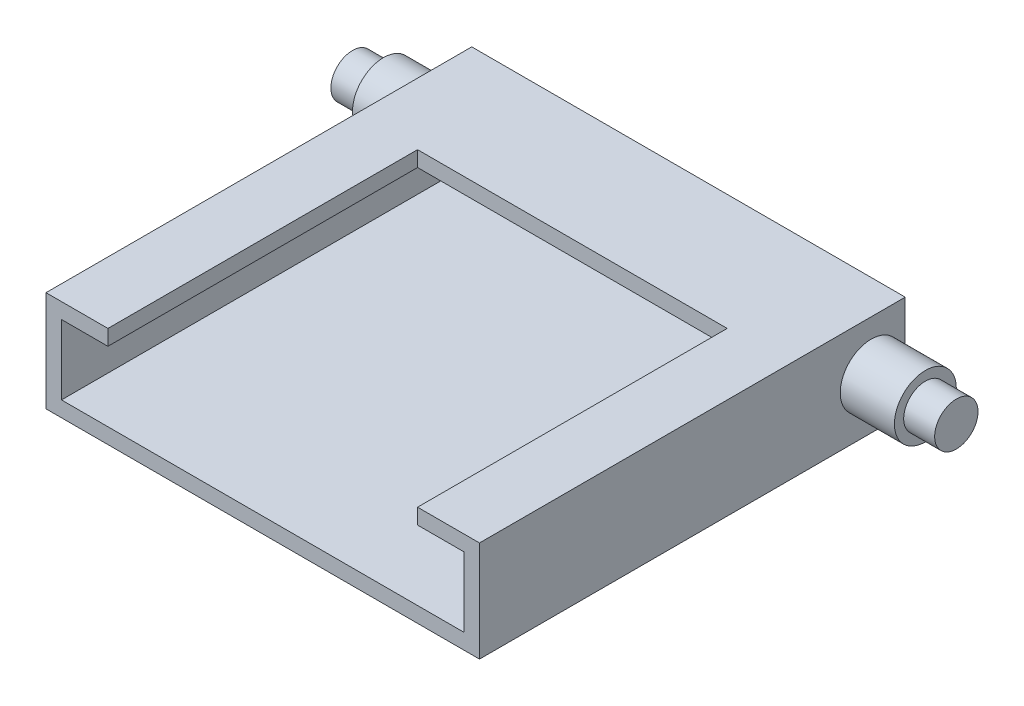
ISO-10303-21;
HEADER;
FILE_DESCRIPTION(('STEP AP214'),'2;1');
FILE_NAME('part.step','',(''),(''),'','','');
FILE_SCHEMA(('AUTOMOTIVE_DESIGN { 1 0 10303 214 1 1 1 1 }'));
ENDSEC;
DATA;
#1=APPLICATION_CONTEXT('core data for automotive mechanical design processes');
#2=APPLICATION_PROTOCOL_DEFINITION('international standard','automotive_design',2000,#1);
#3=PRODUCT_CONTEXT('',#1,'mechanical');
#4=PRODUCT('Part','Part','',(#3));
#5=PRODUCT_RELATED_PRODUCT_CATEGORY('part','',(#4));
#6=PRODUCT_DEFINITION_FORMATION('','',#4);
#7=PRODUCT_DEFINITION_CONTEXT('part definition',#1,'design');
#8=PRODUCT_DEFINITION('design','',#6,#7);
#9=PRODUCT_DEFINITION_SHAPE('','',#8);
#10=(LENGTH_UNIT() NAMED_UNIT(*) SI_UNIT(.MILLI.,.METRE.));
#11=(NAMED_UNIT(*) PLANE_ANGLE_UNIT() SI_UNIT($,.RADIAN.));
#12=(NAMED_UNIT(*) SI_UNIT($,.STERADIAN.) SOLID_ANGLE_UNIT());
#13=UNCERTAINTY_MEASURE_WITH_UNIT(LENGTH_MEASURE(1.E-05),#10,'distance_accuracy_value','');
#14=(GEOMETRIC_REPRESENTATION_CONTEXT(3) GLOBAL_UNCERTAINTY_ASSIGNED_CONTEXT((#13)) GLOBAL_UNIT_ASSIGNED_CONTEXT((#10,
#11,#12)) REPRESENTATION_CONTEXT('',''));
#15=CARTESIAN_POINT('',(0.,0.,0.));
#16=DIRECTION('',(0.,0.,1.));
#17=DIRECTION('',(1.,0.,0.));
#18=AXIS2_PLACEMENT_3D('',#15,#16,#17);
#19=CARTESIAN_POINT('',(-44.45,8.255,-29.337));
#20=DIRECTION('',(-1.,0.,0.));
#21=DIRECTION('',(0.,0.,1.));
#22=AXIS2_PLACEMENT_3D('',#19,#20,#21);
#23=PLANE('',#22);
#24=CARTESIAN_POINT('',(-44.45,8.255,-29.337));
#25=DIRECTION('',(-1.,0.,0.));
#26=DIRECTION('',(0.,0.,1.));
#27=AXIS2_PLACEMENT_3D('',#24,#25,#26);
#28=CIRCLE('',#27,5.08);
#29=CARTESIAN_POINT('',(-44.45,8.255,-24.257));
#30=VERTEX_POINT('',#29);
#31=EDGE_CURVE('E218',#30,#30,#28,.T.);
#32=ORIENTED_EDGE('',*,*,#31,.T.);
#33=EDGE_LOOP('',(#32));
#34=FACE_BOUND('',#33,.T.);
#35=CARTESIAN_POINT('',(-44.45,8.255,-29.337));
#36=DIRECTION('',(-1.,0.,0.));
#37=DIRECTION('',(0.,0.,1.));
#38=AXIS2_PLACEMENT_3D('',#35,#36,#37);
#39=CIRCLE('',#38,3.556);
#40=CARTESIAN_POINT('',(-44.45,8.255,-25.781));
#41=VERTEX_POINT('',#40);
#42=EDGE_CURVE('E202',#41,#41,#39,.T.);
#43=ORIENTED_EDGE('',*,*,#42,.F.);
#44=EDGE_LOOP('',(#43));
#45=FACE_BOUND('',#44,.T.);
#46=ADVANCED_FACE('F33',(#34,#45),#23,.T.);
#47=CARTESIAN_POINT('',(44.45,8.255,-29.337));
#48=DIRECTION('',(1.,0.,0.));
#49=DIRECTION('',(0.,0.,-1.));
#50=AXIS2_PLACEMENT_3D('',#47,#48,#49);
#51=PLANE('',#50);
#52=CARTESIAN_POINT('',(44.45,8.255,-29.337));
#53=DIRECTION('',(1.,0.,0.));
#54=DIRECTION('',(0.,0.,-1.));
#55=AXIS2_PLACEMENT_3D('',#52,#53,#54);
#56=CIRCLE('',#55,5.07999999999999);
#57=CARTESIAN_POINT('',(44.45,8.255,-34.417));
#58=VERTEX_POINT('',#57);
#59=EDGE_CURVE('E215',#58,#58,#56,.T.);
#60=ORIENTED_EDGE('',*,*,#59,.T.);
#61=EDGE_LOOP('',(#60));
#62=FACE_BOUND('',#61,.T.);
#63=CARTESIAN_POINT('',(44.45,8.255,-29.337));
#64=DIRECTION('',(1.,0.,0.));
#65=DIRECTION('',(0.,0.,-1.));
#66=AXIS2_PLACEMENT_3D('',#63,#64,#65);
#67=CIRCLE('',#66,3.556);
#68=CARTESIAN_POINT('',(44.45,8.255,-32.893));
#69=VERTEX_POINT('',#68);
#70=EDGE_CURVE('E206',#69,#69,#67,.T.);
#71=ORIENTED_EDGE('',*,*,#70,.F.);
#72=EDGE_LOOP('',(#71));
#73=FACE_BOUND('',#72,.T.);
#74=ADVANCED_FACE('F345',(#62,#73),#51,.T.);
#75=CARTESIAN_POINT('',(35.56,16.51,-34.925));
#76=DIRECTION('',(1.,0.,0.));
#77=DIRECTION('',(0.,0.,-1.));
#78=AXIS2_PLACEMENT_3D('',#75,#76,#77);
#79=PLANE('',#78);
#80=DIRECTION('',(0.,0.,1.));
#81=VECTOR('',#80,1.);
#82=CARTESIAN_POINT('',(35.56,0.,-34.925));
#83=LINE('',#82,#81);
#84=CARTESIAN_POINT('',(35.56,0.,-34.925));
#85=VERTEX_POINT('',#84);
#86=CARTESIAN_POINT('',(35.56,0.,34.925));
#87=VERTEX_POINT('',#86);
#88=EDGE_CURVE('E273',#85,#87,#83,.T.);
#89=ORIENTED_EDGE('',*,*,#88,.F.);
#90=DIRECTION('',(0.,-1.,0.));
#91=VECTOR('',#90,1.);
#92=CARTESIAN_POINT('',(35.56,16.51,-34.925));
#93=LINE('',#92,#91);
#94=CARTESIAN_POINT('',(35.56,16.51,-34.925));
#95=VERTEX_POINT('',#94);
#96=EDGE_CURVE('E270',#95,#85,#93,.T.);
#97=ORIENTED_EDGE('',*,*,#96,.F.);
#98=DIRECTION('',(0.,0.,1.));
#99=VECTOR('',#98,1.);
#100=CARTESIAN_POINT('',(35.56,16.51,-34.925));
#101=LINE('',#100,#99);
#102=CARTESIAN_POINT('',(35.56,16.51,34.925));
#103=VERTEX_POINT('',#102);
#104=EDGE_CURVE('E260',#95,#103,#101,.T.);
#105=ORIENTED_EDGE('',*,*,#104,.T.);
#106=DIRECTION('',(0.,-1.,0.));
#107=VECTOR('',#106,1.);
#108=CARTESIAN_POINT('',(35.56,16.51,34.925));
#109=LINE('',#108,#107);
#110=EDGE_CURVE('E284',#103,#87,#109,.T.);
#111=ORIENTED_EDGE('',*,*,#110,.T.);
#112=EDGE_LOOP('',(#89,#97,#105,#111));
#113=FACE_BOUND('',#112,.T.);
#114=CARTESIAN_POINT('',(35.56,8.255,-29.337));
#115=DIRECTION('',(1.,0.,0.));
#116=DIRECTION('',(0.,0.,-1.));
#117=AXIS2_PLACEMENT_3D('',#114,#115,#116);
#118=CIRCLE('',#117,5.07999999999999);
#119=CARTESIAN_POINT('',(35.56,8.255,-34.417));
#120=VERTEX_POINT('',#119);
#121=EDGE_CURVE('E212',#120,#120,#118,.T.);
#122=ORIENTED_EDGE('',*,*,#121,.F.);
#123=EDGE_LOOP('',(#122));
#124=FACE_BOUND('',#123,.T.);
#125=ADVANCED_FACE('F290',(#113,#124),#79,.T.);
#126=CARTESIAN_POINT('',(-35.56,16.51,-34.925));
#127=DIRECTION('',(1.,0.,0.));
#128=DIRECTION('',(0.,0.,-1.));
#129=AXIS2_PLACEMENT_3D('',#126,#127,#128);
#130=PLANE('',#129);
#131=DIRECTION('',(0.,0.,1.));
#132=VECTOR('',#131,1.);
#133=CARTESIAN_POINT('',(-35.56,0.,-34.925));
#134=LINE('',#133,#132);
#135=CARTESIAN_POINT('',(-35.56,0.,-34.925));
#136=VERTEX_POINT('',#135);
#137=CARTESIAN_POINT('',(-35.56,0.,34.925));
#138=VERTEX_POINT('',#137);
#139=EDGE_CURVE('E261',#136,#138,#134,.T.);
#140=ORIENTED_EDGE('',*,*,#139,.T.);
#141=DIRECTION('',(0.,-1.,0.));
#142=VECTOR('',#141,1.);
#143=CARTESIAN_POINT('',(-35.56,16.51,34.925));
#144=LINE('',#143,#142);
#145=CARTESIAN_POINT('',(-35.56,16.51,34.925));
#146=VERTEX_POINT('',#145);
#147=EDGE_CURVE('E281',#146,#138,#144,.T.);
#148=ORIENTED_EDGE('',*,*,#147,.F.);
#149=DIRECTION('',(0.,0.,1.));
#150=VECTOR('',#149,1.);
#151=CARTESIAN_POINT('',(-35.56,16.51,-34.925));
#152=LINE('',#151,#150);
#153=CARTESIAN_POINT('',(-35.56,16.51,-34.925));
#154=VERTEX_POINT('',#153);
#155=EDGE_CURVE('E268',#154,#146,#152,.T.);
#156=ORIENTED_EDGE('',*,*,#155,.F.);
#157=DIRECTION('',(0.,-1.,0.));
#158=VECTOR('',#157,1.);
#159=CARTESIAN_POINT('',(-35.56,16.51,-34.925));
#160=LINE('',#159,#158);
#161=EDGE_CURVE('E41',#154,#136,#160,.T.);
#162=ORIENTED_EDGE('',*,*,#161,.T.);
#163=EDGE_LOOP('',(#140,#148,#156,#162));
#164=FACE_BOUND('',#163,.T.);
#165=CARTESIAN_POINT('',(-35.56,8.255,-29.337));
#166=DIRECTION('',(1.,0.,0.));
#167=DIRECTION('',(0.,0.,-1.));
#168=AXIS2_PLACEMENT_3D('',#165,#166,#167);
#169=CIRCLE('',#168,5.08);
#170=CARTESIAN_POINT('',(-35.56,8.255,-34.417));
#171=VERTEX_POINT('',#170);
#172=EDGE_CURVE('E11',#171,#171,#169,.F.);
#173=ORIENTED_EDGE('',*,*,#172,.F.);
#174=EDGE_LOOP('',(#173));
#175=FACE_BOUND('',#174,.T.);
#176=ADVANCED_FACE('F299',(#164,#175),#130,.F.);
#177=CARTESIAN_POINT('',(-35.56,16.51,34.925));
#178=DIRECTION('',(0.,0.,-1.));
#179=DIRECTION('',(-1.,0.,0.));
#180=AXIS2_PLACEMENT_3D('',#177,#178,#179);
#181=PLANE('',#180);
#182=DIRECTION('',(1.,0.,0.));
#183=VECTOR('',#182,1.);
#184=CARTESIAN_POINT('',(-35.56,16.51,34.925));
#185=LINE('',#184,#183);
#186=CARTESIAN_POINT('',(25.4,16.51,34.925));
#187=VERTEX_POINT('',#186);
#188=EDGE_CURVE('E264',#187,#103,#185,.T.);
#189=ORIENTED_EDGE('',*,*,#188,.F.);
#190=DIRECTION('',(0.,1.,0.));
#191=VECTOR('',#190,1.);
#192=CARTESIAN_POINT('',(25.4,-57.8720489685532,34.925));
#193=LINE('',#192,#191);
#194=CARTESIAN_POINT('',(25.4,13.97,34.925));
#195=VERTEX_POINT('',#194);
#196=EDGE_CURVE('E180',#195,#187,#193,.T.);
#197=ORIENTED_EDGE('',*,*,#196,.F.);
#198=DIRECTION('',(1.,0.,0.));
#199=VECTOR('',#198,1.);
#200=CARTESIAN_POINT('',(0.,13.97,34.925));
#201=LINE('',#200,#199);
#202=CARTESIAN_POINT('',(33.02,13.97,34.925));
#203=VERTEX_POINT('',#202);
#204=EDGE_CURVE('E247',#195,#203,#201,.T.);
#205=ORIENTED_EDGE('',*,*,#204,.T.);
#206=DIRECTION('',(0.,-1.,0.));
#207=VECTOR('',#206,1.);
#208=CARTESIAN_POINT('',(33.02,16.51,34.925));
#209=LINE('',#208,#207);
#210=CARTESIAN_POINT('',(33.02,2.54,34.925));
#211=VERTEX_POINT('',#210);
#212=EDGE_CURVE('E238',#203,#211,#209,.T.);
#213=ORIENTED_EDGE('',*,*,#212,.T.);
#214=DIRECTION('',(1.,0.,0.));
#215=VECTOR('',#214,1.);
#216=CARTESIAN_POINT('',(0.,2.54,34.925));
#217=LINE('',#216,#215);
#218=CARTESIAN_POINT('',(-33.02,2.54,34.925));
#219=VERTEX_POINT('',#218);
#220=EDGE_CURVE('E241',#219,#211,#217,.T.);
#221=ORIENTED_EDGE('',*,*,#220,.F.);
#222=DIRECTION('',(0.,-1.,0.));
#223=VECTOR('',#222,1.);
#224=CARTESIAN_POINT('',(-33.02,16.51,34.925));
#225=LINE('',#224,#223);
#226=CARTESIAN_POINT('',(-33.02,13.97,34.925));
#227=VERTEX_POINT('',#226);
#228=EDGE_CURVE('E230',#227,#219,#225,.T.);
#229=ORIENTED_EDGE('',*,*,#228,.F.);
#230=CARTESIAN_POINT('',(-25.4,13.97,34.925));
#231=VERTEX_POINT('',#230);
#232=EDGE_CURVE('E244',#227,#231,#201,.T.);
#233=ORIENTED_EDGE('',*,*,#232,.T.);
#234=DIRECTION('',(0.,1.,0.));
#235=VECTOR('',#234,1.);
#236=CARTESIAN_POINT('',(-25.4,-57.8720489685532,34.925));
#237=LINE('',#236,#235);
#238=CARTESIAN_POINT('',(-25.4,16.51,34.925));
#239=VERTEX_POINT('',#238);
#240=EDGE_CURVE('E188',#231,#239,#237,.T.);
#241=ORIENTED_EDGE('',*,*,#240,.T.);
#242=EDGE_CURVE('E265',#146,#239,#185,.T.);
#243=ORIENTED_EDGE('',*,*,#242,.F.);
#244=ORIENTED_EDGE('',*,*,#147,.T.);
#245=DIRECTION('',(1.,0.,0.));
#246=VECTOR('',#245,1.);
#247=CARTESIAN_POINT('',(-35.56,0.,34.925));
#248=LINE('',#247,#246);
#249=EDGE_CURVE('E276',#138,#87,#248,.T.);
#250=ORIENTED_EDGE('',*,*,#249,.T.);
#251=ORIENTED_EDGE('',*,*,#110,.F.);
#252=EDGE_LOOP('',(#189,#197,#205,#213,#221,#229,#233,#241,#243,#244,#250,#251));
#253=FACE_BOUND('',#252,.T.);
#254=ADVANCED_FACE('F305',(#253),#181,.F.);
#255=CARTESIAN_POINT('',(-35.56,16.51,-34.925));
#256=DIRECTION('',(0.,0.,-1.));
#257=DIRECTION('',(-1.,0.,0.));
#258=AXIS2_PLACEMENT_3D('',#255,#256,#257);
#259=PLANE('',#258);
#260=DIRECTION('',(0.,-1.,0.));
#261=VECTOR('',#260,1.);
#262=CARTESIAN_POINT('',(12.7,11.43,-34.925));
#263=LINE('',#262,#261);
#264=CARTESIAN_POINT('',(12.7,11.43,-34.925));
#265=VERTEX_POINT('',#264);
#266=CARTESIAN_POINT('',(12.7,5.08,-34.925));
#267=VERTEX_POINT('',#266);
#268=EDGE_CURVE('E48',#265,#267,#263,.T.);
#269=ORIENTED_EDGE('',*,*,#268,.F.);
#270=DIRECTION('',(1.,0.,0.));
#271=VECTOR('',#270,1.);
#272=CARTESIAN_POINT('',(12.7,11.43,-34.925));
#273=LINE('',#272,#271);
#274=CARTESIAN_POINT('',(-12.7,11.43,-34.925));
#275=VERTEX_POINT('',#274);
#276=EDGE_CURVE('E164',#275,#265,#273,.T.);
#277=ORIENTED_EDGE('',*,*,#276,.F.);
#278=DIRECTION('',(0.,1.,0.));
#279=VECTOR('',#278,1.);
#280=CARTESIAN_POINT('',(-12.7,11.43,-34.925));
#281=LINE('',#280,#279);
#282=CARTESIAN_POINT('',(-12.7,5.08,-34.925));
#283=VERTEX_POINT('',#282);
#284=EDGE_CURVE('E149',#283,#275,#281,.T.);
#285=ORIENTED_EDGE('',*,*,#284,.F.);
#286=DIRECTION('',(-1.,0.,0.));
#287=VECTOR('',#286,1.);
#288=CARTESIAN_POINT('',(12.7,5.08,-34.925));
#289=LINE('',#288,#287);
#290=EDGE_CURVE('E158',#267,#283,#289,.T.);
#291=ORIENTED_EDGE('',*,*,#290,.F.);
#292=EDGE_LOOP('',(#269,#277,#285,#291));
#293=FACE_BOUND('',#292,.T.);
#294=DIRECTION('',(1.,0.,0.));
#295=VECTOR('',#294,1.);
#296=CARTESIAN_POINT('',(-35.56,0.,-34.925));
#297=LINE('',#296,#295);
#298=EDGE_CURVE('E229',#136,#85,#297,.T.);
#299=ORIENTED_EDGE('',*,*,#298,.F.);
#300=ORIENTED_EDGE('',*,*,#161,.F.);
#301=DIRECTION('',(1.,0.,0.));
#302=VECTOR('',#301,1.);
#303=CARTESIAN_POINT('',(-35.56,16.51,-34.925));
#304=LINE('',#303,#302);
#305=EDGE_CURVE('E257',#154,#95,#304,.T.);
#306=ORIENTED_EDGE('',*,*,#305,.T.);
#307=ORIENTED_EDGE('',*,*,#96,.T.);
#308=EDGE_LOOP('',(#299,#300,#306,#307));
#309=FACE_BOUND('',#308,.T.);
#310=ADVANCED_FACE('F35',(#293,#309),#259,.T.);
#311=CARTESIAN_POINT('',(0.,16.51,0.));
#312=DIRECTION('',(0.,-1.,0.));
#313=DIRECTION('',(0.,0.,-1.));
#314=AXIS2_PLACEMENT_3D('',#311,#312,#313);
#315=PLANE('',#314);
#316=DIRECTION('',(-1.,0.,0.));
#317=VECTOR('',#316,1.);
#318=CARTESIAN_POINT('',(-25.4,16.51,-15.875));
#319=LINE('',#318,#317);
#320=CARTESIAN_POINT('',(25.4,16.51,-15.875));
#321=VERTEX_POINT('',#320);
#322=CARTESIAN_POINT('',(-25.4,16.51,-15.875));
#323=VERTEX_POINT('',#322);
#324=EDGE_CURVE('E177',#321,#323,#319,.T.);
#325=ORIENTED_EDGE('',*,*,#324,.F.);
#326=DIRECTION('',(0.,0.,-1.));
#327=VECTOR('',#326,1.);
#328=CARTESIAN_POINT('',(25.4,16.51,34.925));
#329=LINE('',#328,#327);
#330=EDGE_CURVE('E181',#187,#321,#329,.T.);
#331=ORIENTED_EDGE('',*,*,#330,.F.);
#332=ORIENTED_EDGE('',*,*,#188,.T.);
#333=ORIENTED_EDGE('',*,*,#104,.F.);
#334=ORIENTED_EDGE('',*,*,#305,.F.);
#335=ORIENTED_EDGE('',*,*,#155,.T.);
#336=ORIENTED_EDGE('',*,*,#242,.T.);
#337=DIRECTION('',(0.,0.,1.));
#338=VECTOR('',#337,1.);
#339=CARTESIAN_POINT('',(-25.4,16.51,34.925));
#340=LINE('',#339,#338);
#341=EDGE_CURVE('E175',#323,#239,#340,.T.);
#342=ORIENTED_EDGE('',*,*,#341,.F.);
#343=EDGE_LOOP('',(#325,#331,#332,#333,#334,#335,#336,#342));
#344=FACE_BOUND('',#343,.T.);
#345=ADVANCED_FACE('F309',(#344),#315,.F.);
#346=CARTESIAN_POINT('',(0.,0.,0.));
#347=DIRECTION('',(0.,-1.,0.));
#348=DIRECTION('',(0.,0.,-1.));
#349=AXIS2_PLACEMENT_3D('',#346,#347,#348);
#350=PLANE('',#349);
#351=ORIENTED_EDGE('',*,*,#298,.T.);
#352=ORIENTED_EDGE('',*,*,#88,.T.);
#353=ORIENTED_EDGE('',*,*,#249,.F.);
#354=ORIENTED_EDGE('',*,*,#139,.F.);
#355=EDGE_LOOP('',(#351,#352,#353,#354));
#356=FACE_BOUND('',#355,.T.);
#357=ADVANCED_FACE('F296',(#356),#350,.T.);
#358=CARTESIAN_POINT('',(-35.56,16.51,-32.385));
#359=DIRECTION('',(0.,0.,-1.));
#360=DIRECTION('',(-1.,0.,0.));
#361=AXIS2_PLACEMENT_3D('',#358,#359,#360);
#362=PLANE('',#361);
#363=DIRECTION('',(-1.,0.,0.));
#364=VECTOR('',#363,1.);
#365=CARTESIAN_POINT('',(12.7,11.43,-32.385));
#366=LINE('',#365,#364);
#367=CARTESIAN_POINT('',(12.7,11.43,-32.385));
#368=VERTEX_POINT('',#367);
#369=CARTESIAN_POINT('',(-12.7,11.43,-32.385));
#370=VERTEX_POINT('',#369);
#371=EDGE_CURVE('E569',#368,#370,#366,.T.);
#372=ORIENTED_EDGE('',*,*,#371,.F.);
#373=DIRECTION('',(0.,1.,0.));
#374=VECTOR('',#373,1.);
#375=CARTESIAN_POINT('',(12.7,11.43,-32.385));
#376=LINE('',#375,#374);
#377=CARTESIAN_POINT('',(12.7,5.08,-32.385));
#378=VERTEX_POINT('',#377);
#379=EDGE_CURVE('E176',#378,#368,#376,.T.);
#380=ORIENTED_EDGE('',*,*,#379,.F.);
#381=DIRECTION('',(1.,0.,0.));
#382=VECTOR('',#381,1.);
#383=CARTESIAN_POINT('',(12.7,5.08,-32.385));
#384=LINE('',#383,#382);
#385=CARTESIAN_POINT('',(-12.7,5.08,-32.385));
#386=VERTEX_POINT('',#385);
#387=EDGE_CURVE('E173',#386,#378,#384,.T.);
#388=ORIENTED_EDGE('',*,*,#387,.F.);
#389=DIRECTION('',(0.,-1.,0.));
#390=VECTOR('',#389,1.);
#391=CARTESIAN_POINT('',(-12.7,11.43,-32.385));
#392=LINE('',#391,#390);
#393=EDGE_CURVE('E152',#370,#386,#392,.T.);
#394=ORIENTED_EDGE('',*,*,#393,.F.);
#395=EDGE_LOOP('',(#372,#380,#388,#394));
#396=FACE_BOUND('',#395,.T.);
#397=DIRECTION('',(1.,0.,0.));
#398=VECTOR('',#397,1.);
#399=CARTESIAN_POINT('',(0.,2.54,-32.385));
#400=LINE('',#399,#398);
#401=CARTESIAN_POINT('',(-33.02,2.54,-32.385));
#402=VERTEX_POINT('',#401);
#403=CARTESIAN_POINT('',(33.02,2.54,-32.385));
#404=VERTEX_POINT('',#403);
#405=EDGE_CURVE('E223',#402,#404,#400,.T.);
#406=ORIENTED_EDGE('',*,*,#405,.T.);
#407=DIRECTION('',(0.,-1.,0.));
#408=VECTOR('',#407,1.);
#409=CARTESIAN_POINT('',(33.02,16.51,-32.385));
#410=LINE('',#409,#408);
#411=CARTESIAN_POINT('',(33.02,13.97,-32.385));
#412=VERTEX_POINT('',#411);
#413=EDGE_CURVE('E236',#412,#404,#410,.T.);
#414=ORIENTED_EDGE('',*,*,#413,.F.);
#415=DIRECTION('',(1.,0.,0.));
#416=VECTOR('',#415,1.);
#417=CARTESIAN_POINT('',(0.,13.97,-32.385));
#418=LINE('',#417,#416);
#419=CARTESIAN_POINT('',(-33.02,13.97,-32.385));
#420=VERTEX_POINT('',#419);
#421=EDGE_CURVE('E231',#420,#412,#418,.T.);
#422=ORIENTED_EDGE('',*,*,#421,.F.);
#423=DIRECTION('',(0.,-1.,0.));
#424=VECTOR('',#423,1.);
#425=CARTESIAN_POINT('',(-33.02,16.51,-32.385));
#426=LINE('',#425,#424);
#427=EDGE_CURVE('E227',#420,#402,#426,.T.);
#428=ORIENTED_EDGE('',*,*,#427,.T.);
#429=EDGE_LOOP('',(#406,#414,#422,#428));
#430=FACE_BOUND('',#429,.T.);
#431=ADVANCED_FACE('F332',(#396,#430),#362,.F.);
#432=CARTESIAN_POINT('',(-33.02,16.51,-34.925));
#433=DIRECTION('',(1.,0.,0.));
#434=DIRECTION('',(0.,0.,-1.));
#435=AXIS2_PLACEMENT_3D('',#432,#433,#434);
#436=PLANE('',#435);
#437=DIRECTION('',(0.,0.,1.));
#438=VECTOR('',#437,1.);
#439=CARTESIAN_POINT('',(-33.02,2.54,0.));
#440=LINE('',#439,#438);
#441=EDGE_CURVE('E235',#402,#219,#440,.T.);
#442=ORIENTED_EDGE('',*,*,#441,.F.);
#443=ORIENTED_EDGE('',*,*,#427,.F.);
#444=DIRECTION('',(0.,0.,1.));
#445=VECTOR('',#444,1.);
#446=CARTESIAN_POINT('',(-33.02,13.97,0.));
#447=LINE('',#446,#445);
#448=EDGE_CURVE('E239',#420,#227,#447,.T.);
#449=ORIENTED_EDGE('',*,*,#448,.T.);
#450=ORIENTED_EDGE('',*,*,#228,.T.);
#451=EDGE_LOOP('',(#442,#443,#449,#450));
#452=FACE_BOUND('',#451,.T.);
#453=ADVANCED_FACE('F330',(#452),#436,.T.);
#454=CARTESIAN_POINT('',(33.02,16.51,-34.925));
#455=DIRECTION('',(1.,0.,0.));
#456=DIRECTION('',(0.,0.,-1.));
#457=AXIS2_PLACEMENT_3D('',#454,#455,#456);
#458=PLANE('',#457);
#459=DIRECTION('',(0.,0.,1.));
#460=VECTOR('',#459,1.);
#461=CARTESIAN_POINT('',(33.02,2.54,0.));
#462=LINE('',#461,#460);
#463=EDGE_CURVE('E226',#404,#211,#462,.T.);
#464=ORIENTED_EDGE('',*,*,#463,.T.);
#465=ORIENTED_EDGE('',*,*,#212,.F.);
#466=DIRECTION('',(0.,0.,1.));
#467=VECTOR('',#466,1.);
#468=CARTESIAN_POINT('',(33.02,13.97,0.));
#469=LINE('',#468,#467);
#470=EDGE_CURVE('E234',#412,#203,#469,.T.);
#471=ORIENTED_EDGE('',*,*,#470,.F.);
#472=ORIENTED_EDGE('',*,*,#413,.T.);
#473=EDGE_LOOP('',(#464,#465,#471,#472));
#474=FACE_BOUND('',#473,.T.);
#475=ADVANCED_FACE('F321',(#474),#458,.F.);
#476=CARTESIAN_POINT('',(0.,13.97,0.));
#477=DIRECTION('',(0.,-1.,0.));
#478=DIRECTION('',(0.,0.,-1.));
#479=AXIS2_PLACEMENT_3D('',#476,#477,#478);
#480=PLANE('',#479);
#481=DIRECTION('',(0.,0.,-1.));
#482=VECTOR('',#481,1.);
#483=CARTESIAN_POINT('',(25.4,13.97,34.925));
#484=LINE('',#483,#482);
#485=CARTESIAN_POINT('',(25.4,13.97,-15.875));
#486=VERTEX_POINT('',#485);
#487=EDGE_CURVE('E194',#195,#486,#484,.T.);
#488=ORIENTED_EDGE('',*,*,#487,.T.);
#489=DIRECTION('',(-1.,0.,0.));
#490=VECTOR('',#489,1.);
#491=CARTESIAN_POINT('',(-25.4,13.97,-15.875));
#492=LINE('',#491,#490);
#493=CARTESIAN_POINT('',(-25.4,13.97,-15.875));
#494=VERTEX_POINT('',#493);
#495=EDGE_CURVE('E190',#486,#494,#492,.T.);
#496=ORIENTED_EDGE('',*,*,#495,.T.);
#497=DIRECTION('',(0.,0.,1.));
#498=VECTOR('',#497,1.);
#499=CARTESIAN_POINT('',(-25.4,13.97,34.925));
#500=LINE('',#499,#498);
#501=EDGE_CURVE('E185',#494,#231,#500,.T.);
#502=ORIENTED_EDGE('',*,*,#501,.T.);
#503=ORIENTED_EDGE('',*,*,#232,.F.);
#504=ORIENTED_EDGE('',*,*,#448,.F.);
#505=ORIENTED_EDGE('',*,*,#421,.T.);
#506=ORIENTED_EDGE('',*,*,#470,.T.);
#507=ORIENTED_EDGE('',*,*,#204,.F.);
#508=EDGE_LOOP('',(#488,#496,#502,#503,#504,#505,#506,#507));
#509=FACE_BOUND('',#508,.T.);
#510=ADVANCED_FACE('F316',(#509),#480,.T.);
#511=CARTESIAN_POINT('',(0.,2.54,0.));
#512=DIRECTION('',(0.,-1.,0.));
#513=DIRECTION('',(0.,0.,-1.));
#514=AXIS2_PLACEMENT_3D('',#511,#512,#513);
#515=PLANE('',#514);
#516=ORIENTED_EDGE('',*,*,#405,.F.);
#517=ORIENTED_EDGE('',*,*,#441,.T.);
#518=ORIENTED_EDGE('',*,*,#220,.T.);
#519=ORIENTED_EDGE('',*,*,#463,.F.);
#520=EDGE_LOOP('',(#516,#517,#518,#519));
#521=FACE_BOUND('',#520,.T.);
#522=ADVANCED_FACE('F327',(#521),#515,.F.);
#523=CARTESIAN_POINT('',(-44.45,8.255,-29.337));
#524=DIRECTION('',(1.,0.,0.));
#525=DIRECTION('',(0.,0.,-1.));
#526=AXIS2_PLACEMENT_3D('',#523,#524,#525);
#527=CYLINDRICAL_SURFACE('',#526,5.08);
#528=ORIENTED_EDGE('',*,*,#31,.F.);
#529=EDGE_LOOP('',(#528));
#530=FACE_BOUND('',#529,.T.);
#531=ORIENTED_EDGE('',*,*,#172,.T.);
#532=EDGE_LOOP('',(#531));
#533=FACE_BOUND('',#532,.T.);
#534=ADVANCED_FACE('F356',(#530,#533),#527,.T.);
#535=CARTESIAN_POINT('',(44.45,8.255,-29.337));
#536=DIRECTION('',(-1.,0.,0.));
#537=DIRECTION('',(0.,0.,1.));
#538=AXIS2_PLACEMENT_3D('',#535,#536,#537);
#539=CYLINDRICAL_SURFACE('',#538,5.07999999999999);
#540=ORIENTED_EDGE('',*,*,#59,.F.);
#541=EDGE_LOOP('',(#540));
#542=FACE_BOUND('',#541,.T.);
#543=ORIENTED_EDGE('',*,*,#121,.T.);
#544=EDGE_LOOP('',(#543));
#545=FACE_BOUND('',#544,.T.);
#546=ADVANCED_FACE('F355',(#542,#545),#539,.T.);
#547=CARTESIAN_POINT('',(49.53,8.255,-29.337));
#548=DIRECTION('',(-1.,0.,0.));
#549=DIRECTION('',(0.,0.,1.));
#550=AXIS2_PLACEMENT_3D('',#547,#548,#549);
#551=CYLINDRICAL_SURFACE('',#550,3.556);
#552=CARTESIAN_POINT('',(49.53,8.255,-29.337));
#553=DIRECTION('',(1.,0.,0.));
#554=DIRECTION('',(0.,0.,-1.));
#555=AXIS2_PLACEMENT_3D('',#552,#553,#554);
#556=CIRCLE('',#555,3.556);
#557=CARTESIAN_POINT('',(49.53,8.255,-32.893));
#558=VERTEX_POINT('',#557);
#559=EDGE_CURVE('E209',#558,#558,#556,.T.);
#560=ORIENTED_EDGE('',*,*,#559,.F.);
#561=EDGE_LOOP('',(#560));
#562=FACE_BOUND('',#561,.T.);
#563=ORIENTED_EDGE('',*,*,#70,.T.);
#564=EDGE_LOOP('',(#563));
#565=FACE_BOUND('',#564,.T.);
#566=ADVANCED_FACE('F363',(#562,#565),#551,.T.);
#567=CARTESIAN_POINT('',(49.53,8.255,-29.337));
#568=DIRECTION('',(1.,0.,0.));
#569=DIRECTION('',(0.,0.,-1.));
#570=AXIS2_PLACEMENT_3D('',#567,#568,#569);
#571=PLANE('',#570);
#572=ORIENTED_EDGE('',*,*,#559,.T.);
#573=EDGE_LOOP('',(#572));
#574=FACE_BOUND('',#573,.T.);
#575=ADVANCED_FACE('F431',(#574),#571,.T.);
#576=CARTESIAN_POINT('',(-49.53,8.255,-29.337));
#577=DIRECTION('',(1.,0.,0.));
#578=DIRECTION('',(0.,0.,-1.));
#579=AXIS2_PLACEMENT_3D('',#576,#577,#578);
#580=CYLINDRICAL_SURFACE('',#579,3.556);
#581=CARTESIAN_POINT('',(-49.53,8.255,-29.337));
#582=DIRECTION('',(-1.,0.,0.));
#583=DIRECTION('',(0.,0.,1.));
#584=AXIS2_PLACEMENT_3D('',#581,#582,#583);
#585=CIRCLE('',#584,3.556);
#586=CARTESIAN_POINT('',(-49.53,8.255,-25.781));
#587=VERTEX_POINT('',#586);
#588=EDGE_CURVE('E203',#587,#587,#585,.T.);
#589=ORIENTED_EDGE('',*,*,#588,.F.);
#590=EDGE_LOOP('',(#589));
#591=FACE_BOUND('',#590,.T.);
#592=ORIENTED_EDGE('',*,*,#42,.T.);
#593=EDGE_LOOP('',(#592));
#594=FACE_BOUND('',#593,.T.);
#595=ADVANCED_FACE('F440',(#591,#594),#580,.T.);
#596=CARTESIAN_POINT('',(-49.53,8.255,-29.337));
#597=DIRECTION('',(-1.,0.,0.));
#598=DIRECTION('',(0.,0.,1.));
#599=AXIS2_PLACEMENT_3D('',#596,#597,#598);
#600=PLANE('',#599);
#601=ORIENTED_EDGE('',*,*,#588,.T.);
#602=EDGE_LOOP('',(#601));
#603=FACE_BOUND('',#602,.T.);
#604=ADVANCED_FACE('F455',(#603),#600,.T.);
#605=CARTESIAN_POINT('',(25.4,-57.8720489685532,34.925));
#606=DIRECTION('',(1.,0.,0.));
#607=DIRECTION('',(0.,0.,-1.));
#608=AXIS2_PLACEMENT_3D('',#605,#606,#607);
#609=PLANE('',#608);
#610=ORIENTED_EDGE('',*,*,#196,.T.);
#611=ORIENTED_EDGE('',*,*,#330,.T.);
#612=DIRECTION('',(0.,1.,0.));
#613=VECTOR('',#612,1.);
#614=CARTESIAN_POINT('',(25.4,-57.8720489685532,-15.875));
#615=LINE('',#614,#613);
#616=EDGE_CURVE('E193',#486,#321,#615,.T.);
#617=ORIENTED_EDGE('',*,*,#616,.F.);
#618=ORIENTED_EDGE('',*,*,#487,.F.);
#619=EDGE_LOOP('',(#610,#611,#617,#618));
#620=FACE_BOUND('',#619,.T.);
#621=ADVANCED_FACE('F465',(#620),#609,.F.);
#622=CARTESIAN_POINT('',(-25.4,-57.8720489685532,-15.875));
#623=DIRECTION('',(0.,0.,-1.));
#624=DIRECTION('',(-1.,0.,0.));
#625=AXIS2_PLACEMENT_3D('',#622,#623,#624);
#626=PLANE('',#625);
#627=ORIENTED_EDGE('',*,*,#616,.T.);
#628=ORIENTED_EDGE('',*,*,#324,.T.);
#629=DIRECTION('',(0.,1.,0.));
#630=VECTOR('',#629,1.);
#631=CARTESIAN_POINT('',(-25.4,-57.8720489685532,-15.875));
#632=LINE('',#631,#630);
#633=EDGE_CURVE('E189',#494,#323,#632,.T.);
#634=ORIENTED_EDGE('',*,*,#633,.F.);
#635=ORIENTED_EDGE('',*,*,#495,.F.);
#636=EDGE_LOOP('',(#627,#628,#634,#635));
#637=FACE_BOUND('',#636,.T.);
#638=ADVANCED_FACE('F547',(#637),#626,.F.);
#639=CARTESIAN_POINT('',(-25.4,-57.8720489685532,34.925));
#640=DIRECTION('',(-1.,0.,0.));
#641=DIRECTION('',(0.,0.,1.));
#642=AXIS2_PLACEMENT_3D('',#639,#640,#641);
#643=PLANE('',#642);
#644=ORIENTED_EDGE('',*,*,#633,.T.);
#645=ORIENTED_EDGE('',*,*,#341,.T.);
#646=ORIENTED_EDGE('',*,*,#240,.F.);
#647=ORIENTED_EDGE('',*,*,#501,.F.);
#648=EDGE_LOOP('',(#644,#645,#646,#647));
#649=FACE_BOUND('',#648,.T.);
#650=ADVANCED_FACE('F514',(#649),#643,.F.);
#651=CARTESIAN_POINT('',(12.7,11.43,-6.20327927732784));
#652=DIRECTION('',(1.,0.,0.));
#653=DIRECTION('',(0.,0.,-1.));
#654=AXIS2_PLACEMENT_3D('',#651,#652,#653);
#655=PLANE('',#654);
#656=ORIENTED_EDGE('',*,*,#379,.T.);
#657=DIRECTION('',(0.,0.,-1.));
#658=VECTOR('',#657,1.);
#659=CARTESIAN_POINT('',(12.7,11.43,-6.20327927732784));
#660=LINE('',#659,#658);
#661=EDGE_CURVE('E169',#368,#265,#660,.T.);
#662=ORIENTED_EDGE('',*,*,#661,.T.);
#663=ORIENTED_EDGE('',*,*,#268,.T.);
#664=DIRECTION('',(0.,0.,-1.));
#665=VECTOR('',#664,1.);
#666=CARTESIAN_POINT('',(12.7,5.08,-6.20327927732784));
#667=LINE('',#666,#665);
#668=EDGE_CURVE('E155',#378,#267,#667,.T.);
#669=ORIENTED_EDGE('',*,*,#668,.F.);
#670=EDGE_LOOP('',(#656,#662,#663,#669));
#671=FACE_BOUND('',#670,.T.);
#672=ADVANCED_FACE('F508',(#671),#655,.F.);
#673=CARTESIAN_POINT('',(12.7,11.43,-6.20327927732784));
#674=DIRECTION('',(0.,1.,0.));
#675=DIRECTION('',(-1.,0.,0.));
#676=AXIS2_PLACEMENT_3D('',#673,#674,#675);
#677=PLANE('',#676);
#678=ORIENTED_EDGE('',*,*,#371,.T.);
#679=DIRECTION('',(0.,0.,-1.));
#680=VECTOR('',#679,1.);
#681=CARTESIAN_POINT('',(-12.7,11.43,-6.20327927732784));
#682=LINE('',#681,#680);
#683=EDGE_CURVE('E154',#370,#275,#682,.T.);
#684=ORIENTED_EDGE('',*,*,#683,.T.);
#685=ORIENTED_EDGE('',*,*,#276,.T.);
#686=ORIENTED_EDGE('',*,*,#661,.F.);
#687=EDGE_LOOP('',(#678,#684,#685,#686));
#688=FACE_BOUND('',#687,.T.);
#689=ADVANCED_FACE('F513',(#688),#677,.F.);
#690=CARTESIAN_POINT('',(-12.7,11.43,-6.20327927732784));
#691=DIRECTION('',(-1.,0.,0.));
#692=DIRECTION('',(0.,0.,1.));
#693=AXIS2_PLACEMENT_3D('',#690,#691,#692);
#694=PLANE('',#693);
#695=ORIENTED_EDGE('',*,*,#393,.T.);
#696=DIRECTION('',(0.,0.,-1.));
#697=VECTOR('',#696,1.);
#698=CARTESIAN_POINT('',(-12.7,5.08,-6.20327927732784));
#699=LINE('',#698,#697);
#700=EDGE_CURVE('E56',#386,#283,#699,.T.);
#701=ORIENTED_EDGE('',*,*,#700,.T.);
#702=ORIENTED_EDGE('',*,*,#284,.T.);
#703=ORIENTED_EDGE('',*,*,#683,.F.);
#704=EDGE_LOOP('',(#695,#701,#702,#703));
#705=FACE_BOUND('',#704,.T.);
#706=ADVANCED_FACE('F146',(#705),#694,.F.);
#707=CARTESIAN_POINT('',(12.7,5.08,-6.20327927732784));
#708=DIRECTION('',(0.,-1.,0.));
#709=DIRECTION('',(0.,0.,-1.));
#710=AXIS2_PLACEMENT_3D('',#707,#708,#709);
#711=PLANE('',#710);
#712=ORIENTED_EDGE('',*,*,#387,.T.);
#713=ORIENTED_EDGE('',*,*,#668,.T.);
#714=ORIENTED_EDGE('',*,*,#290,.T.);
#715=ORIENTED_EDGE('',*,*,#700,.F.);
#716=EDGE_LOOP('',(#712,#713,#714,#715));
#717=FACE_BOUND('',#716,.T.);
#718=ADVANCED_FACE('F159',(#717),#711,.F.);
#719=CLOSED_SHELL('',(#46,#74,#125,#176,#254,#310,#345,#357,#431,#453,#475,#510,#522,#534,#546,
#566,#575,#595,#604,#621,#638,#650,#672,#689,#706,#718));
#720=MANIFOLD_SOLID_BREP('B2',#719);
#721=ADVANCED_BREP_SHAPE_REPRESENTATION('',(#18,#720),#14);
#722=SHAPE_DEFINITION_REPRESENTATION(#9,#721);
ENDSEC;
END-ISO-10303-21;
